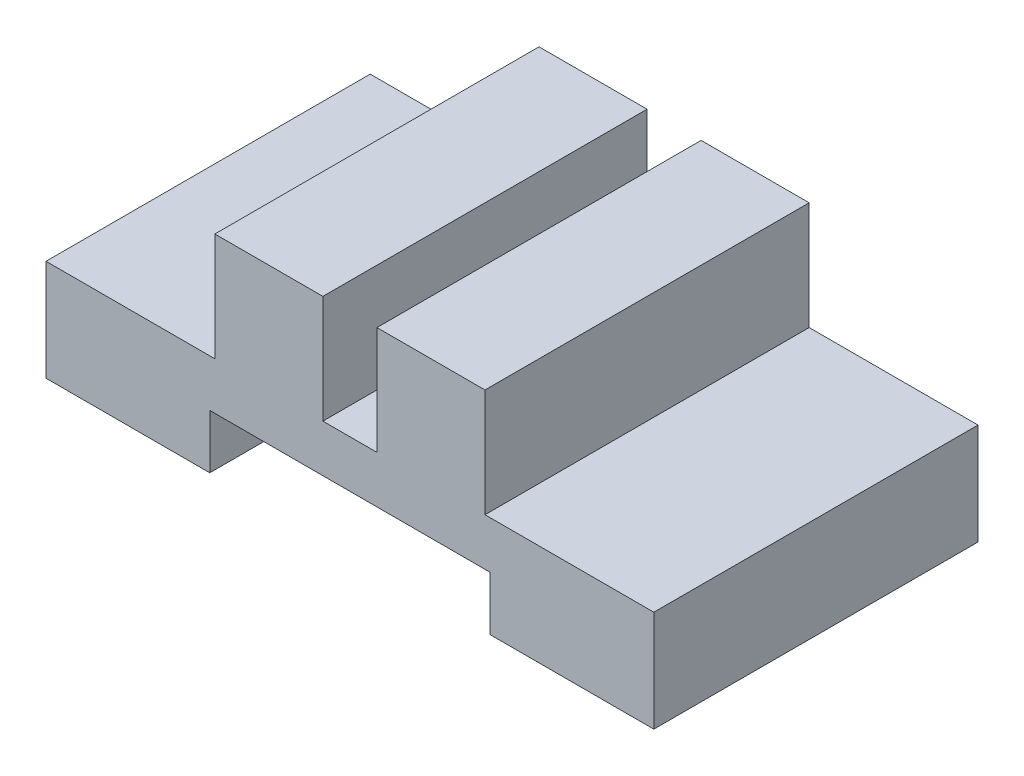
ISO-10303-21;
HEADER;
FILE_DESCRIPTION(('STEP AP214'),'2;1');
FILE_NAME('part.step','',(''),(''),'','','');
FILE_SCHEMA(('AUTOMOTIVE_DESIGN { 1 0 10303 214 1 1 1 1 }'));
ENDSEC;
DATA;
#1=APPLICATION_CONTEXT('core data for automotive mechanical design processes');
#2=APPLICATION_PROTOCOL_DEFINITION('international standard','automotive_design',2000,#1);
#3=PRODUCT_CONTEXT('',#1,'mechanical');
#4=PRODUCT('Part','Part','',(#3));
#5=PRODUCT_RELATED_PRODUCT_CATEGORY('part','',(#4));
#6=PRODUCT_DEFINITION_FORMATION('','',#4);
#7=PRODUCT_DEFINITION_CONTEXT('part definition',#1,'design');
#8=PRODUCT_DEFINITION('design','',#6,#7);
#9=PRODUCT_DEFINITION_SHAPE('','',#8);
#10=(LENGTH_UNIT() NAMED_UNIT(*) SI_UNIT(.MILLI.,.METRE.));
#11=(NAMED_UNIT(*) PLANE_ANGLE_UNIT() SI_UNIT($,.RADIAN.));
#12=(NAMED_UNIT(*) SI_UNIT($,.STERADIAN.) SOLID_ANGLE_UNIT());
#13=UNCERTAINTY_MEASURE_WITH_UNIT(LENGTH_MEASURE(1.E-05),#10,'distance_accuracy_value','');
#14=(GEOMETRIC_REPRESENTATION_CONTEXT(3) GLOBAL_UNCERTAINTY_ASSIGNED_CONTEXT((#13)) GLOBAL_UNIT_ASSIGNED_CONTEXT((#10,
#11,#12)) REPRESENTATION_CONTEXT('',''));
#15=CARTESIAN_POINT('',(0.,0.,0.));
#16=DIRECTION('',(0.,0.,1.));
#17=DIRECTION('',(1.,0.,0.));
#18=AXIS2_PLACEMENT_3D('',#15,#16,#17);
#19=CARTESIAN_POINT('',(0.,1.5,0.));
#20=DIRECTION('',(0.,-1.,0.));
#21=DIRECTION('',(0.,0.,-1.));
#22=AXIS2_PLACEMENT_3D('',#19,#20,#21);
#23=PLANE('',#22);
#24=DIRECTION('',(0.,0.,1.));
#25=VECTOR('',#24,1.);
#26=CARTESIAN_POINT('',(-2.,1.5,2.4));
#27=LINE('',#26,#25);
#28=CARTESIAN_POINT('',(-2.,1.5,-2.4));
#29=VERTEX_POINT('',#28);
#30=CARTESIAN_POINT('',(-2.,1.5,2.4));
#31=VERTEX_POINT('',#30);
#32=EDGE_CURVE('E59',#29,#31,#27,.T.);
#33=ORIENTED_EDGE('',*,*,#32,.F.);
#34=DIRECTION('',(-1.,0.,0.));
#35=VECTOR('',#34,1.);
#36=CARTESIAN_POINT('',(-4.5,1.5,-2.4));
#37=LINE('',#36,#35);
#38=CARTESIAN_POINT('',(-4.5,1.5,-2.4));
#39=VERTEX_POINT('',#38);
#40=EDGE_CURVE('E283',#29,#39,#37,.T.);
#41=ORIENTED_EDGE('',*,*,#40,.T.);
#42=DIRECTION('',(0.,0.,1.));
#43=VECTOR('',#42,1.);
#44=CARTESIAN_POINT('',(-4.5,1.5,2.4));
#45=LINE('',#44,#43);
#46=CARTESIAN_POINT('',(-4.5,1.5,2.4));
#47=VERTEX_POINT('',#46);
#48=EDGE_CURVE('E288',#39,#47,#45,.T.);
#49=ORIENTED_EDGE('',*,*,#48,.T.);
#50=DIRECTION('',(1.,0.,0.));
#51=VECTOR('',#50,1.);
#52=CARTESIAN_POINT('',(-4.5,1.5,2.4));
#53=LINE('',#52,#51);
#54=EDGE_CURVE('E168',#47,#31,#53,.T.);
#55=ORIENTED_EDGE('',*,*,#54,.T.);
#56=EDGE_LOOP('',(#33,#41,#49,#55));
#57=FACE_BOUND('',#56,.T.);
#58=ADVANCED_FACE('F43',(#57),#23,.F.);
#59=DIRECTION('',(0.,0.,-1.));
#60=VECTOR('',#59,1.);
#61=CARTESIAN_POINT('',(-0.4,1.5,2.4));
#62=LINE('',#61,#60);
#63=CARTESIAN_POINT('',(-0.4,1.5,2.4));
#64=VERTEX_POINT('',#63);
#65=CARTESIAN_POINT('',(-0.4,1.5,-2.4));
#66=VERTEX_POINT('',#65);
#67=EDGE_CURVE('E171',#64,#66,#62,.T.);
#68=ORIENTED_EDGE('',*,*,#67,.F.);
#69=CARTESIAN_POINT('',(0.4,1.5,2.4));
#70=VERTEX_POINT('',#69);
#71=EDGE_CURVE('E158',#64,#70,#53,.T.);
#72=ORIENTED_EDGE('',*,*,#71,.T.);
#73=DIRECTION('',(0.,0.,1.));
#74=VECTOR('',#73,1.);
#75=CARTESIAN_POINT('',(0.4,1.5,-2.4));
#76=LINE('',#75,#74);
#77=CARTESIAN_POINT('',(0.4,1.5,-2.4));
#78=VERTEX_POINT('',#77);
#79=EDGE_CURVE('E198',#78,#70,#76,.T.);
#80=ORIENTED_EDGE('',*,*,#79,.F.);
#81=EDGE_CURVE('E67',#78,#66,#37,.T.);
#82=ORIENTED_EDGE('',*,*,#81,.T.);
#83=EDGE_LOOP('',(#68,#72,#80,#82));
#84=FACE_BOUND('',#83,.T.);
#85=ADVANCED_FACE('F172',(#84),#23,.F.);
#86=DIRECTION('',(0.,0.,-1.));
#87=VECTOR('',#86,1.);
#88=CARTESIAN_POINT('',(2.,1.5,-2.4));
#89=LINE('',#88,#87);
#90=CARTESIAN_POINT('',(2.,1.5,2.4));
#91=VERTEX_POINT('',#90);
#92=CARTESIAN_POINT('',(2.,1.5,-2.4));
#93=VERTEX_POINT('',#92);
#94=EDGE_CURVE('E214',#91,#93,#89,.T.);
#95=ORIENTED_EDGE('',*,*,#94,.F.);
#96=CARTESIAN_POINT('',(4.5,1.5,2.4));
#97=VERTEX_POINT('',#96);
#98=EDGE_CURVE('E169',#91,#97,#53,.T.);
#99=ORIENTED_EDGE('',*,*,#98,.T.);
#100=DIRECTION('',(0.,0.,-1.));
#101=VECTOR('',#100,1.);
#102=CARTESIAN_POINT('',(4.5,1.5,2.4));
#103=LINE('',#102,#101);
#104=CARTESIAN_POINT('',(4.5,1.5,-2.4));
#105=VERTEX_POINT('',#104);
#106=EDGE_CURVE('E279',#97,#105,#103,.T.);
#107=ORIENTED_EDGE('',*,*,#106,.T.);
#108=EDGE_CURVE('E285',#105,#93,#37,.T.);
#109=ORIENTED_EDGE('',*,*,#108,.T.);
#110=EDGE_LOOP('',(#95,#99,#107,#109));
#111=FACE_BOUND('',#110,.T.);
#112=ADVANCED_FACE('F338',(#111),#23,.F.);
#113=CARTESIAN_POINT('',(0.,0.,0.));
#114=DIRECTION('',(0.,-1.,0.));
#115=DIRECTION('',(0.,0.,-1.));
#116=AXIS2_PLACEMENT_3D('',#113,#114,#115);
#117=PLANE('',#116);
#118=DIRECTION('',(0.,0.,1.));
#119=VECTOR('',#118,1.);
#120=CARTESIAN_POINT('',(2.075,0.,-2.4));
#121=LINE('',#120,#119);
#122=CARTESIAN_POINT('',(2.075,0.,-2.4));
#123=VERTEX_POINT('',#122);
#124=CARTESIAN_POINT('',(2.075,0.,2.4));
#125=VERTEX_POINT('',#124);
#126=EDGE_CURVE('E242',#123,#125,#121,.T.);
#127=ORIENTED_EDGE('',*,*,#126,.F.);
#128=DIRECTION('',(-1.,0.,0.));
#129=VECTOR('',#128,1.);
#130=CARTESIAN_POINT('',(-4.5,0.,-2.4));
#131=LINE('',#130,#129);
#132=CARTESIAN_POINT('',(4.5,0.,-2.4));
#133=VERTEX_POINT('',#132);
#134=EDGE_CURVE('E297',#133,#123,#131,.T.);
#135=ORIENTED_EDGE('',*,*,#134,.F.);
#136=DIRECTION('',(0.,0.,-1.));
#137=VECTOR('',#136,1.);
#138=CARTESIAN_POINT('',(4.5,0.,2.4));
#139=LINE('',#138,#137);
#140=CARTESIAN_POINT('',(4.5,0.,2.4));
#141=VERTEX_POINT('',#140);
#142=EDGE_CURVE('E268',#141,#133,#139,.T.);
#143=ORIENTED_EDGE('',*,*,#142,.F.);
#144=DIRECTION('',(1.,0.,0.));
#145=VECTOR('',#144,1.);
#146=CARTESIAN_POINT('',(-4.5,0.,2.4));
#147=LINE('',#146,#145);
#148=EDGE_CURVE('E304',#125,#141,#147,.T.);
#149=ORIENTED_EDGE('',*,*,#148,.F.);
#150=EDGE_LOOP('',(#127,#135,#143,#149));
#151=FACE_BOUND('',#150,.T.);
#152=ADVANCED_FACE('F380',(#151),#117,.T.);
#153=CARTESIAN_POINT('',(4.5,1.5,2.4));
#154=DIRECTION('',(-1.,0.,0.));
#155=DIRECTION('',(0.,0.,1.));
#156=AXIS2_PLACEMENT_3D('',#153,#154,#155);
#157=PLANE('',#156);
#158=ORIENTED_EDGE('',*,*,#142,.T.);
#159=DIRECTION('',(0.,-1.,0.));
#160=VECTOR('',#159,1.);
#161=CARTESIAN_POINT('',(4.5,1.5,-2.4));
#162=LINE('',#161,#160);
#163=EDGE_CURVE('E11',#105,#133,#162,.T.);
#164=ORIENTED_EDGE('',*,*,#163,.F.);
#165=ORIENTED_EDGE('',*,*,#106,.F.);
#166=DIRECTION('',(0.,-1.,0.));
#167=VECTOR('',#166,1.);
#168=CARTESIAN_POINT('',(4.5,1.5,2.4));
#169=LINE('',#168,#167);
#170=EDGE_CURVE('E292',#97,#141,#169,.T.);
#171=ORIENTED_EDGE('',*,*,#170,.T.);
#172=EDGE_LOOP('',(#158,#164,#165,#171));
#173=FACE_BOUND('',#172,.T.);
#174=ADVANCED_FACE('F45',(#173),#157,.F.);
#175=CARTESIAN_POINT('',(-4.5,1.5,-2.4));
#176=DIRECTION('',(0.,0.,1.));
#177=DIRECTION('',(1.,0.,0.));
#178=AXIS2_PLACEMENT_3D('',#175,#176,#177);
#179=PLANE('',#178);
#180=ORIENTED_EDGE('',*,*,#134,.T.);
#181=DIRECTION('',(0.,-1.,0.));
#182=VECTOR('',#181,1.);
#183=CARTESIAN_POINT('',(2.075,0.8,-2.4));
#184=LINE('',#183,#182);
#185=CARTESIAN_POINT('',(2.075,0.8,-2.4));
#186=VERTEX_POINT('',#185);
#187=EDGE_CURVE('E265',#186,#123,#184,.T.);
#188=ORIENTED_EDGE('',*,*,#187,.F.);
#189=DIRECTION('',(1.,0.,0.));
#190=VECTOR('',#189,1.);
#191=CARTESIAN_POINT('',(-2.075,0.8,-2.4));
#192=LINE('',#191,#190);
#193=CARTESIAN_POINT('',(-2.075,0.8,-2.4));
#194=VERTEX_POINT('',#193);
#195=EDGE_CURVE('E256',#194,#186,#192,.T.);
#196=ORIENTED_EDGE('',*,*,#195,.F.);
#197=DIRECTION('',(0.,-1.,0.));
#198=VECTOR('',#197,1.);
#199=CARTESIAN_POINT('',(-2.075,0.8,-2.4));
#200=LINE('',#199,#198);
#201=CARTESIAN_POINT('',(-2.075,0.,-2.4));
#202=VERTEX_POINT('',#201);
#203=EDGE_CURVE('E269',#194,#202,#200,.T.);
#204=ORIENTED_EDGE('',*,*,#203,.T.);
#205=CARTESIAN_POINT('',(-4.5,0.,-2.4));
#206=VERTEX_POINT('',#205);
#207=EDGE_CURVE('E296',#202,#206,#131,.T.);
#208=ORIENTED_EDGE('',*,*,#207,.T.);
#209=DIRECTION('',(0.,-1.,0.));
#210=VECTOR('',#209,1.);
#211=CARTESIAN_POINT('',(-4.5,1.5,-2.4));
#212=LINE('',#211,#210);
#213=EDGE_CURVE('E52',#39,#206,#212,.T.);
#214=ORIENTED_EDGE('',*,*,#213,.F.);
#215=ORIENTED_EDGE('',*,*,#40,.F.);
#216=DIRECTION('',(0.,-1.,0.));
#217=VECTOR('',#216,1.);
#218=CARTESIAN_POINT('',(-2.,3.1,-2.4));
#219=LINE('',#218,#217);
#220=CARTESIAN_POINT('',(-2.,3.1,-2.4));
#221=VERTEX_POINT('',#220);
#222=EDGE_CURVE('E187',#221,#29,#219,.T.);
#223=ORIENTED_EDGE('',*,*,#222,.F.);
#224=DIRECTION('',(-1.,0.,0.));
#225=VECTOR('',#224,1.);
#226=CARTESIAN_POINT('',(-2.,3.1,-2.4));
#227=LINE('',#226,#225);
#228=CARTESIAN_POINT('',(-0.4,3.1,-2.4));
#229=VERTEX_POINT('',#228);
#230=EDGE_CURVE('E194',#229,#221,#227,.T.);
#231=ORIENTED_EDGE('',*,*,#230,.F.);
#232=DIRECTION('',(0.,-1.,0.));
#233=VECTOR('',#232,1.);
#234=CARTESIAN_POINT('',(-0.4,3.1,-2.4));
#235=LINE('',#234,#233);
#236=EDGE_CURVE('E182',#229,#66,#235,.T.);
#237=ORIENTED_EDGE('',*,*,#236,.T.);
#238=ORIENTED_EDGE('',*,*,#81,.F.);
#239=DIRECTION('',(0.,-1.,0.));
#240=VECTOR('',#239,1.);
#241=CARTESIAN_POINT('',(0.4,3.1,-2.4));
#242=LINE('',#241,#240);
#243=CARTESIAN_POINT('',(0.4,3.1,-2.4));
#244=VERTEX_POINT('',#243);
#245=EDGE_CURVE('E223',#244,#78,#242,.T.);
#246=ORIENTED_EDGE('',*,*,#245,.F.);
#247=DIRECTION('',(-1.,0.,0.));
#248=VECTOR('',#247,1.);
#249=CARTESIAN_POINT('',(0.4,3.1,-2.4));
#250=LINE('',#249,#248);
#251=CARTESIAN_POINT('',(2.,3.1,-2.4));
#252=VERTEX_POINT('',#251);
#253=EDGE_CURVE('E220',#252,#244,#250,.T.);
#254=ORIENTED_EDGE('',*,*,#253,.F.);
#255=DIRECTION('',(0.,-1.,0.));
#256=VECTOR('',#255,1.);
#257=CARTESIAN_POINT('',(2.,3.1,-2.4));
#258=LINE('',#257,#256);
#259=EDGE_CURVE('E232',#252,#93,#258,.T.);
#260=ORIENTED_EDGE('',*,*,#259,.T.);
#261=ORIENTED_EDGE('',*,*,#108,.F.);
#262=ORIENTED_EDGE('',*,*,#163,.T.);
#263=EDGE_LOOP('',(#180,#188,#196,#204,#208,#214,#215,#223,#231,#237,#238,#246,#254,#260,#261,#262));
#264=FACE_BOUND('',#263,.T.);
#265=ADVANCED_FACE('F345',(#264),#179,.F.);
#266=CARTESIAN_POINT('',(-4.5,1.5,2.4));
#267=DIRECTION('',(1.,0.,0.));
#268=DIRECTION('',(0.,0.,-1.));
#269=AXIS2_PLACEMENT_3D('',#266,#267,#268);
#270=PLANE('',#269);
#271=DIRECTION('',(0.,0.,1.));
#272=VECTOR('',#271,1.);
#273=CARTESIAN_POINT('',(-4.5,0.,2.4));
#274=LINE('',#273,#272);
#275=CARTESIAN_POINT('',(-4.5,0.,2.4));
#276=VERTEX_POINT('',#275);
#277=EDGE_CURVE('E301',#206,#276,#274,.T.);
#278=ORIENTED_EDGE('',*,*,#277,.T.);
#279=DIRECTION('',(0.,-1.,0.));
#280=VECTOR('',#279,1.);
#281=CARTESIAN_POINT('',(-4.5,1.5,2.4));
#282=LINE('',#281,#280);
#283=EDGE_CURVE('E311',#47,#276,#282,.T.);
#284=ORIENTED_EDGE('',*,*,#283,.F.);
#285=ORIENTED_EDGE('',*,*,#48,.F.);
#286=ORIENTED_EDGE('',*,*,#213,.T.);
#287=EDGE_LOOP('',(#278,#284,#285,#286));
#288=FACE_BOUND('',#287,.T.);
#289=ADVANCED_FACE('F320',(#288),#270,.F.);
#290=CARTESIAN_POINT('',(-4.5,1.5,2.4));
#291=DIRECTION('',(0.,0.,-1.));
#292=DIRECTION('',(-1.,0.,0.));
#293=AXIS2_PLACEMENT_3D('',#290,#291,#292);
#294=PLANE('',#293);
#295=DIRECTION('',(-1.,0.,0.));
#296=VECTOR('',#295,1.);
#297=CARTESIAN_POINT('',(-2.075,0.8,2.4));
#298=LINE('',#297,#296);
#299=CARTESIAN_POINT('',(2.075,0.8,2.4));
#300=VERTEX_POINT('',#299);
#301=CARTESIAN_POINT('',(-2.075,0.8,2.4));
#302=VERTEX_POINT('',#301);
#303=EDGE_CURVE('E247',#300,#302,#298,.T.);
#304=ORIENTED_EDGE('',*,*,#303,.F.);
#305=DIRECTION('',(0.,-1.,0.));
#306=VECTOR('',#305,1.);
#307=CARTESIAN_POINT('',(2.075,0.8,2.4));
#308=LINE('',#307,#306);
#309=EDGE_CURVE('E260',#300,#125,#308,.T.);
#310=ORIENTED_EDGE('',*,*,#309,.T.);
#311=ORIENTED_EDGE('',*,*,#148,.T.);
#312=ORIENTED_EDGE('',*,*,#170,.F.);
#313=ORIENTED_EDGE('',*,*,#98,.F.);
#314=DIRECTION('',(0.,-1.,0.));
#315=VECTOR('',#314,1.);
#316=CARTESIAN_POINT('',(2.,3.1,2.4));
#317=LINE('',#316,#315);
#318=CARTESIAN_POINT('',(2.,3.1,2.4));
#319=VERTEX_POINT('',#318);
#320=EDGE_CURVE('E236',#319,#91,#317,.T.);
#321=ORIENTED_EDGE('',*,*,#320,.F.);
#322=DIRECTION('',(1.,0.,0.));
#323=VECTOR('',#322,1.);
#324=CARTESIAN_POINT('',(0.4,3.1,2.4));
#325=LINE('',#324,#323);
#326=CARTESIAN_POINT('',(0.4,3.1,2.4));
#327=VERTEX_POINT('',#326);
#328=EDGE_CURVE('E213',#327,#319,#325,.T.);
#329=ORIENTED_EDGE('',*,*,#328,.F.);
#330=DIRECTION('',(0.,-1.,0.));
#331=VECTOR('',#330,1.);
#332=CARTESIAN_POINT('',(0.4,3.1,2.4));
#333=LINE('',#332,#331);
#334=EDGE_CURVE('E165',#327,#70,#333,.T.);
#335=ORIENTED_EDGE('',*,*,#334,.T.);
#336=ORIENTED_EDGE('',*,*,#71,.F.);
#337=DIRECTION('',(0.,-1.,0.));
#338=VECTOR('',#337,1.);
#339=CARTESIAN_POINT('',(-0.4,3.1,2.4));
#340=LINE('',#339,#338);
#341=CARTESIAN_POINT('',(-0.4,3.1,2.4));
#342=VERTEX_POINT('',#341);
#343=EDGE_CURVE('E162',#342,#64,#340,.T.);
#344=ORIENTED_EDGE('',*,*,#343,.F.);
#345=DIRECTION('',(1.,0.,0.));
#346=VECTOR('',#345,1.);
#347=CARTESIAN_POINT('',(-2.,3.1,2.4));
#348=LINE('',#347,#346);
#349=CARTESIAN_POINT('',(-2.,3.1,2.4));
#350=VERTEX_POINT('',#349);
#351=EDGE_CURVE('E203',#350,#342,#348,.T.);
#352=ORIENTED_EDGE('',*,*,#351,.F.);
#353=DIRECTION('',(0.,-1.,0.));
#354=VECTOR('',#353,1.);
#355=CARTESIAN_POINT('',(-2.,3.1,2.4));
#356=LINE('',#355,#354);
#357=EDGE_CURVE('E183',#350,#31,#356,.T.);
#358=ORIENTED_EDGE('',*,*,#357,.T.);
#359=ORIENTED_EDGE('',*,*,#54,.F.);
#360=ORIENTED_EDGE('',*,*,#283,.T.);
#361=CARTESIAN_POINT('',(-2.075,0.,2.4));
#362=VERTEX_POINT('',#361);
#363=EDGE_CURVE('E284',#276,#362,#147,.T.);
#364=ORIENTED_EDGE('',*,*,#363,.T.);
#365=DIRECTION('',(0.,-1.,0.));
#366=VECTOR('',#365,1.);
#367=CARTESIAN_POINT('',(-2.075,0.8,2.4));
#368=LINE('',#367,#366);
#369=EDGE_CURVE('E273',#302,#362,#368,.T.);
#370=ORIENTED_EDGE('',*,*,#369,.F.);
#371=EDGE_LOOP('',(#304,#310,#311,#312,#313,#321,#329,#335,#336,#344,#352,#358,#359,#360,#364,#370));
#372=FACE_BOUND('',#371,.T.);
#373=ADVANCED_FACE('F160',(#372),#294,.F.);
#374=DIRECTION('',(0.,0.,-1.));
#375=VECTOR('',#374,1.);
#376=CARTESIAN_POINT('',(-2.075,0.,-2.4));
#377=LINE('',#376,#375);
#378=EDGE_CURVE('E248',#362,#202,#377,.T.);
#379=ORIENTED_EDGE('',*,*,#378,.F.);
#380=ORIENTED_EDGE('',*,*,#363,.F.);
#381=ORIENTED_EDGE('',*,*,#277,.F.);
#382=ORIENTED_EDGE('',*,*,#207,.F.);
#383=EDGE_LOOP('',(#379,#380,#381,#382));
#384=FACE_BOUND('',#383,.T.);
#385=ADVANCED_FACE('F327',(#384),#117,.T.);
#386=CARTESIAN_POINT('',(2.075,0.8,-2.4));
#387=DIRECTION('',(1.,0.,0.));
#388=DIRECTION('',(0.,0.,-1.));
#389=AXIS2_PLACEMENT_3D('',#386,#387,#388);
#390=PLANE('',#389);
#391=ORIENTED_EDGE('',*,*,#126,.T.);
#392=ORIENTED_EDGE('',*,*,#309,.F.);
#393=DIRECTION('',(0.,0.,1.));
#394=VECTOR('',#393,1.);
#395=CARTESIAN_POINT('',(2.075,0.8,-2.4));
#396=LINE('',#395,#394);
#397=EDGE_CURVE('E243',#186,#300,#396,.T.);
#398=ORIENTED_EDGE('',*,*,#397,.F.);
#399=ORIENTED_EDGE('',*,*,#187,.T.);
#400=EDGE_LOOP('',(#391,#392,#398,#399));
#401=FACE_BOUND('',#400,.T.);
#402=ADVANCED_FACE('F391',(#401),#390,.F.);
#403=CARTESIAN_POINT('',(-2.075,0.8,-2.4));
#404=DIRECTION('',(-1.,0.,0.));
#405=DIRECTION('',(0.,0.,1.));
#406=AXIS2_PLACEMENT_3D('',#403,#404,#405);
#407=PLANE('',#406);
#408=ORIENTED_EDGE('',*,*,#378,.T.);
#409=ORIENTED_EDGE('',*,*,#203,.F.);
#410=DIRECTION('',(0.,0.,-1.));
#411=VECTOR('',#410,1.);
#412=CARTESIAN_POINT('',(-2.075,0.8,-2.4));
#413=LINE('',#412,#411);
#414=EDGE_CURVE('E252',#302,#194,#413,.T.);
#415=ORIENTED_EDGE('',*,*,#414,.F.);
#416=ORIENTED_EDGE('',*,*,#369,.T.);
#417=EDGE_LOOP('',(#408,#409,#415,#416));
#418=FACE_BOUND('',#417,.T.);
#419=ADVANCED_FACE('F396',(#418),#407,.F.);
#420=CARTESIAN_POINT('',(0.,0.8,0.));
#421=DIRECTION('',(0.,1.,0.));
#422=DIRECTION('',(0.,0.,1.));
#423=AXIS2_PLACEMENT_3D('',#420,#421,#422);
#424=PLANE('',#423);
#425=ORIENTED_EDGE('',*,*,#397,.T.);
#426=ORIENTED_EDGE('',*,*,#303,.T.);
#427=ORIENTED_EDGE('',*,*,#414,.T.);
#428=ORIENTED_EDGE('',*,*,#195,.T.);
#429=EDGE_LOOP('',(#425,#426,#427,#428));
#430=FACE_BOUND('',#429,.T.);
#431=ADVANCED_FACE('F441',(#430),#424,.F.);
#432=CARTESIAN_POINT('',(0.4,3.1,-2.4));
#433=DIRECTION('',(1.,0.,0.));
#434=DIRECTION('',(0.,0.,-1.));
#435=AXIS2_PLACEMENT_3D('',#432,#433,#434);
#436=PLANE('',#435);
#437=ORIENTED_EDGE('',*,*,#79,.T.);
#438=ORIENTED_EDGE('',*,*,#334,.F.);
#439=DIRECTION('',(0.,0.,1.));
#440=VECTOR('',#439,1.);
#441=CARTESIAN_POINT('',(0.4,3.1,-2.4));
#442=LINE('',#441,#440);
#443=EDGE_CURVE('E209',#244,#327,#442,.T.);
#444=ORIENTED_EDGE('',*,*,#443,.F.);
#445=ORIENTED_EDGE('',*,*,#245,.T.);
#446=EDGE_LOOP('',(#437,#438,#444,#445));
#447=FACE_BOUND('',#446,.T.);
#448=ADVANCED_FACE('F357',(#447),#436,.F.);
#449=CARTESIAN_POINT('',(2.,3.1,-2.4));
#450=DIRECTION('',(-1.,0.,0.));
#451=DIRECTION('',(0.,0.,1.));
#452=AXIS2_PLACEMENT_3D('',#449,#450,#451);
#453=PLANE('',#452);
#454=ORIENTED_EDGE('',*,*,#94,.T.);
#455=ORIENTED_EDGE('',*,*,#259,.F.);
#456=DIRECTION('',(0.,0.,-1.));
#457=VECTOR('',#456,1.);
#458=CARTESIAN_POINT('',(2.,3.1,-2.4));
#459=LINE('',#458,#457);
#460=EDGE_CURVE('E217',#319,#252,#459,.T.);
#461=ORIENTED_EDGE('',*,*,#460,.F.);
#462=ORIENTED_EDGE('',*,*,#320,.T.);
#463=EDGE_LOOP('',(#454,#455,#461,#462));
#464=FACE_BOUND('',#463,.T.);
#465=ADVANCED_FACE('F350',(#464),#453,.F.);
#466=CARTESIAN_POINT('',(0.,3.1,0.));
#467=DIRECTION('',(0.,1.,0.));
#468=DIRECTION('',(0.,0.,1.));
#469=AXIS2_PLACEMENT_3D('',#466,#467,#468);
#470=PLANE('',#469);
#471=ORIENTED_EDGE('',*,*,#443,.T.);
#472=ORIENTED_EDGE('',*,*,#328,.T.);
#473=ORIENTED_EDGE('',*,*,#460,.T.);
#474=ORIENTED_EDGE('',*,*,#253,.T.);
#475=EDGE_LOOP('',(#471,#472,#473,#474));
#476=FACE_BOUND('',#475,.T.);
#477=ADVANCED_FACE('F354',(#476),#470,.T.);
#478=CARTESIAN_POINT('',(-2.,3.1,2.4));
#479=DIRECTION('',(1.,0.,0.));
#480=DIRECTION('',(0.,0.,-1.));
#481=AXIS2_PLACEMENT_3D('',#478,#479,#480);
#482=PLANE('',#481);
#483=ORIENTED_EDGE('',*,*,#32,.T.);
#484=ORIENTED_EDGE('',*,*,#357,.F.);
#485=DIRECTION('',(0.,0.,1.));
#486=VECTOR('',#485,1.);
#487=CARTESIAN_POINT('',(-2.,3.1,2.4));
#488=LINE('',#487,#486);
#489=EDGE_CURVE('E177',#221,#350,#488,.T.);
#490=ORIENTED_EDGE('',*,*,#489,.F.);
#491=ORIENTED_EDGE('',*,*,#222,.T.);
#492=EDGE_LOOP('',(#483,#484,#490,#491));
#493=FACE_BOUND('',#492,.T.);
#494=ADVANCED_FACE('F363',(#493),#482,.F.);
#495=CARTESIAN_POINT('',(-0.4,3.1,2.4));
#496=DIRECTION('',(-1.,0.,0.));
#497=DIRECTION('',(0.,0.,1.));
#498=AXIS2_PLACEMENT_3D('',#495,#496,#497);
#499=PLANE('',#498);
#500=ORIENTED_EDGE('',*,*,#67,.T.);
#501=ORIENTED_EDGE('',*,*,#236,.F.);
#502=DIRECTION('',(0.,0.,-1.));
#503=VECTOR('',#502,1.);
#504=CARTESIAN_POINT('',(-0.4,3.1,2.4));
#505=LINE('',#504,#503);
#506=EDGE_CURVE('E180',#342,#229,#505,.T.);
#507=ORIENTED_EDGE('',*,*,#506,.F.);
#508=ORIENTED_EDGE('',*,*,#343,.T.);
#509=EDGE_LOOP('',(#500,#501,#507,#508));
#510=FACE_BOUND('',#509,.T.);
#511=ADVANCED_FACE('F179',(#510),#499,.F.);
#512=CARTESIAN_POINT('',(0.,3.1,0.));
#513=DIRECTION('',(0.,-1.,0.));
#514=DIRECTION('',(0.,0.,-1.));
#515=AXIS2_PLACEMENT_3D('',#512,#513,#514);
#516=PLANE('',#515);
#517=ORIENTED_EDGE('',*,*,#489,.T.);
#518=ORIENTED_EDGE('',*,*,#351,.T.);
#519=ORIENTED_EDGE('',*,*,#506,.T.);
#520=ORIENTED_EDGE('',*,*,#230,.T.);
#521=EDGE_LOOP('',(#517,#518,#519,#520));
#522=FACE_BOUND('',#521,.T.);
#523=ADVANCED_FACE('F361',(#522),#516,.F.);
#524=CLOSED_SHELL('',(#58,#85,#112,#152,#174,#265,#289,#373,#385,#402,#419,#431,#448,#465,#477,
#494,#511,#523));
#525=MANIFOLD_SOLID_BREP('B2',#524);
#526=ADVANCED_BREP_SHAPE_REPRESENTATION('',(#18,#525),#14);
#527=SHAPE_DEFINITION_REPRESENTATION(#9,#526);
ENDSEC;
END-ISO-10303-21;
